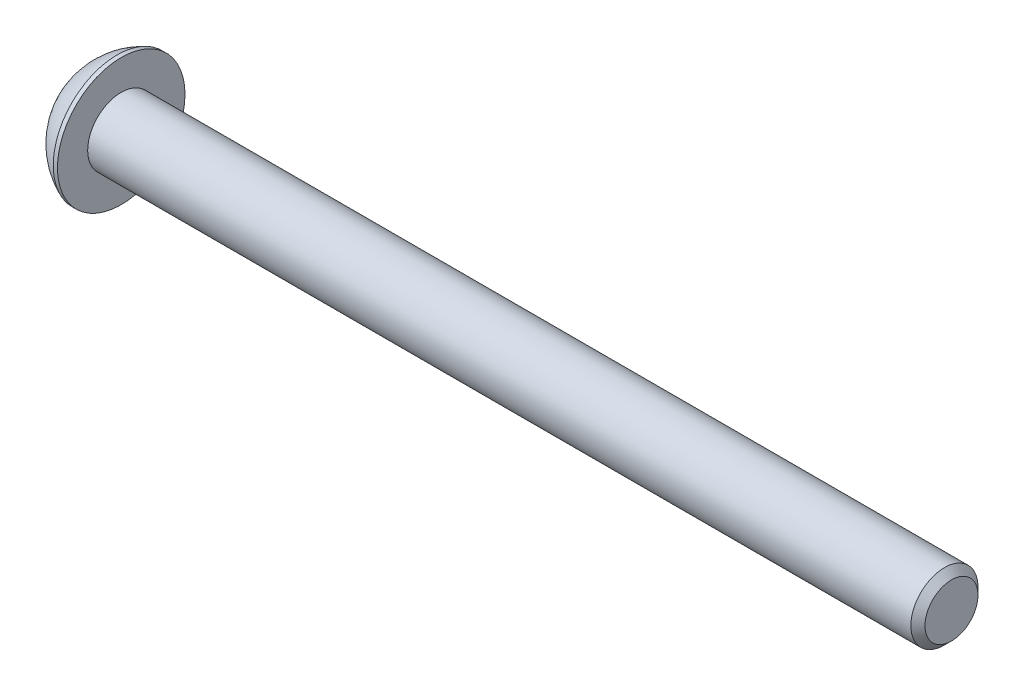
ISO-10303-21;
HEADER;
FILE_DESCRIPTION(('STEP AP214'),'2;1');
FILE_NAME('part.step','',(''),(''),'','','');
FILE_SCHEMA(('AUTOMOTIVE_DESIGN { 1 0 10303 214 1 1 1 1 }'));
ENDSEC;
DATA;
#1=APPLICATION_CONTEXT('core data for automotive mechanical design processes');
#2=APPLICATION_PROTOCOL_DEFINITION('international standard','automotive_design',2000,#1);
#3=PRODUCT_CONTEXT('',#1,'mechanical');
#4=PRODUCT('Part','Part','',(#3));
#5=PRODUCT_RELATED_PRODUCT_CATEGORY('part','',(#4));
#6=PRODUCT_DEFINITION_FORMATION('','',#4);
#7=PRODUCT_DEFINITION_CONTEXT('part definition',#1,'design');
#8=PRODUCT_DEFINITION('design','',#6,#7);
#9=PRODUCT_DEFINITION_SHAPE('','',#8);
#10=(LENGTH_UNIT() NAMED_UNIT(*) SI_UNIT(.MILLI.,.METRE.));
#11=(NAMED_UNIT(*) PLANE_ANGLE_UNIT() SI_UNIT($,.RADIAN.));
#12=(NAMED_UNIT(*) SI_UNIT($,.STERADIAN.) SOLID_ANGLE_UNIT());
#13=UNCERTAINTY_MEASURE_WITH_UNIT(LENGTH_MEASURE(1.E-05),#10,'distance_accuracy_value','');
#14=(GEOMETRIC_REPRESENTATION_CONTEXT(3) GLOBAL_UNCERTAINTY_ASSIGNED_CONTEXT((#13)) GLOBAL_UNIT_ASSIGNED_CONTEXT((#10,
#11,#12)) REPRESENTATION_CONTEXT('',''));
#15=CARTESIAN_POINT('',(0.,0.,0.));
#16=DIRECTION('',(0.,0.,1.));
#17=DIRECTION('',(1.,0.,0.));
#18=AXIS2_PLACEMENT_3D('',#15,#16,#17);
#19=CARTESIAN_POINT('',(-0.279400000000001,-1.5875,0.916543552338531));
#20=DIRECTION('',(-1.,0.,0.));
#21=DIRECTION('',(0.,0.,1.));
#22=AXIS2_PLACEMENT_3D('',#19,#20,#21);
#23=PLANE('',#22);
#24=DIRECTION('',(0.,0.866025403784439,0.5));
#25=VECTOR('',#24,1.);
#26=CARTESIAN_POINT('',(-0.279400000000001,1.5875,-0.916543552338531));
#27=LINE('',#26,#25);
#28=CARTESIAN_POINT('',(-0.279400000000001,1.5875,-0.916543552338531));
#29=VERTEX_POINT('',#28);
#30=CARTESIAN_POINT('',(-0.279400000000001,0.,-1.83308710467706));
#31=VERTEX_POINT('',#30);
#32=EDGE_CURVE('E72',#29,#31,#27,.F.);
#33=ORIENTED_EDGE('',*,*,#32,.T.);
#34=DIRECTION('',(0.,0.866025403784439,-0.499999999999999));
#35=VECTOR('',#34,1.);
#36=CARTESIAN_POINT('',(-0.279400000000001,0.,-1.83308710467706));
#37=LINE('',#36,#35);
#38=CARTESIAN_POINT('',(-0.279400000000001,-1.5875,-0.916543552338532));
#39=VERTEX_POINT('',#38);
#40=EDGE_CURVE('E74',#31,#39,#37,.F.);
#41=ORIENTED_EDGE('',*,*,#40,.T.);
#42=DIRECTION('',(0.,0.,-1.));
#43=VECTOR('',#42,1.);
#44=CARTESIAN_POINT('',(-0.279400000000001,-1.5875,-0.916543552338532));
#45=LINE('',#44,#43);
#46=CARTESIAN_POINT('',(-0.279400000000001,-1.5875,0.916543552338531));
#47=VERTEX_POINT('',#46);
#48=EDGE_CURVE('E76',#39,#47,#45,.F.);
#49=ORIENTED_EDGE('',*,*,#48,.T.);
#50=DIRECTION('',(0.,-0.866025403784439,-0.5));
#51=VECTOR('',#50,1.);
#52=CARTESIAN_POINT('',(-0.279400000000001,-1.5875,0.916543552338531));
#53=LINE('',#52,#51);
#54=CARTESIAN_POINT('',(-0.279400000000001,0.,1.83308710467706));
#55=VERTEX_POINT('',#54);
#56=EDGE_CURVE('E132',#47,#55,#53,.F.);
#57=ORIENTED_EDGE('',*,*,#56,.T.);
#58=DIRECTION('',(0.,-0.866025403784439,0.5));
#59=VECTOR('',#58,1.);
#60=CARTESIAN_POINT('',(-0.279400000000001,0.,1.83308710467706));
#61=LINE('',#60,#59);
#62=CARTESIAN_POINT('',(-0.279400000000001,1.5875,0.916543552338531));
#63=VERTEX_POINT('',#62);
#64=EDGE_CURVE('E137',#55,#63,#61,.F.);
#65=ORIENTED_EDGE('',*,*,#64,.T.);
#66=DIRECTION('',(0.,0.,1.));
#67=VECTOR('',#66,1.);
#68=CARTESIAN_POINT('',(-0.279400000000001,1.5875,0.916543552338531));
#69=LINE('',#68,#67);
#70=EDGE_CURVE('E141',#63,#29,#69,.F.);
#71=ORIENTED_EDGE('',*,*,#70,.T.);
#72=EDGE_LOOP('',(#33,#41,#49,#57,#65,#71));
#73=FACE_BOUND('',#72,.T.);
#74=ADVANCED_FACE('F17',(#73),#23,.T.);
#75=CARTESIAN_POINT('',(-0.279400000000001,-1.5875,-0.916543552338532));
#76=DIRECTION('',(0.,-1.,0.));
#77=DIRECTION('',(0.,0.,-1.));
#78=AXIS2_PLACEMENT_3D('',#75,#76,#77);
#79=PLANE('',#78);
#80=DIRECTION('',(1.,0.,0.));
#81=VECTOR('',#80,1.);
#82=CARTESIAN_POINT('',(-0.279400000000001,-1.5875,0.916543552338531));
#83=LINE('',#82,#81);
#84=CARTESIAN_POINT('',(-2.5654,-1.5875,0.91654355233853));
#85=VERTEX_POINT('',#84);
#86=EDGE_CURVE('E87',#85,#47,#83,.T.);
#87=ORIENTED_EDGE('',*,*,#86,.T.);
#88=ORIENTED_EDGE('',*,*,#48,.F.);
#89=DIRECTION('',(1.,0.,0.));
#90=VECTOR('',#89,1.);
#91=CARTESIAN_POINT('',(-0.279400000000001,-1.5875,-0.916543552338532));
#92=LINE('',#91,#90);
#93=CARTESIAN_POINT('',(-2.5654,-1.5875,-0.916543552338532));
#94=VERTEX_POINT('',#93);
#95=EDGE_CURVE('E81',#39,#94,#92,.F.);
#96=ORIENTED_EDGE('',*,*,#95,.T.);
#97=DIRECTION('',(0.,0.,1.));
#98=VECTOR('',#97,1.);
#99=CARTESIAN_POINT('',(-2.5654,-1.5875,0.));
#100=LINE('',#99,#98);
#101=EDGE_CURVE('E129',#85,#94,#100,.F.);
#102=ORIENTED_EDGE('',*,*,#101,.F.);
#103=EDGE_LOOP('',(#87,#88,#96,#102));
#104=FACE_BOUND('',#103,.T.);
#105=ADVANCED_FACE('F84',(#104),#79,.F.);
#106=CARTESIAN_POINT('',(-0.279400000000001,0.,-1.83308710467706));
#107=DIRECTION('',(0.,-0.499999999999999,-0.866025403784439));
#108=DIRECTION('',(0.,0.866025403784439,-0.499999999999999));
#109=AXIS2_PLACEMENT_3D('',#106,#107,#108);
#110=PLANE('',#109);
#111=ORIENTED_EDGE('',*,*,#95,.F.);
#112=ORIENTED_EDGE('',*,*,#40,.F.);
#113=DIRECTION('',(1.,0.,0.));
#114=VECTOR('',#113,1.);
#115=CARTESIAN_POINT('',(-0.279400000000001,0.,-1.83308710467706));
#116=LINE('',#115,#114);
#117=CARTESIAN_POINT('',(-2.5654,0.,-1.83308710467706));
#118=VERTEX_POINT('',#117);
#119=EDGE_CURVE('E95',#31,#118,#116,.F.);
#120=ORIENTED_EDGE('',*,*,#119,.T.);
#121=DIRECTION('',(0.,0.866025403784439,-0.499999999999999));
#122=VECTOR('',#121,1.);
#123=CARTESIAN_POINT('',(-2.5654,-1.5875,-0.916543552338532));
#124=LINE('',#123,#122);
#125=EDGE_CURVE('E92',#94,#118,#124,.T.);
#126=ORIENTED_EDGE('',*,*,#125,.F.);
#127=EDGE_LOOP('',(#111,#112,#120,#126));
#128=FACE_BOUND('',#127,.T.);
#129=ADVANCED_FACE('F90',(#128),#110,.F.);
#130=CARTESIAN_POINT('',(-0.279400000000001,1.5875,-0.916543552338531));
#131=DIRECTION('',(0.,0.5,-0.866025403784439));
#132=DIRECTION('',(0.,0.866025403784439,0.5));
#133=AXIS2_PLACEMENT_3D('',#130,#131,#132);
#134=PLANE('',#133);
#135=ORIENTED_EDGE('',*,*,#119,.F.);
#136=ORIENTED_EDGE('',*,*,#32,.F.);
#137=DIRECTION('',(1.,0.,0.));
#138=VECTOR('',#137,1.);
#139=CARTESIAN_POINT('',(-0.279400000000001,1.5875,-0.91654355233853));
#140=LINE('',#139,#138);
#141=CARTESIAN_POINT('',(-2.5654,1.5875,-0.91654355233853));
#142=VERTEX_POINT('',#141);
#143=EDGE_CURVE('E139',#29,#142,#140,.F.);
#144=ORIENTED_EDGE('',*,*,#143,.T.);
#145=DIRECTION('',(0.,0.866025403784438,0.5));
#146=VECTOR('',#145,1.);
#147=CARTESIAN_POINT('',(-2.5654,0.,-1.83308710467706));
#148=LINE('',#147,#146);
#149=EDGE_CURVE('E125',#118,#142,#148,.T.);
#150=ORIENTED_EDGE('',*,*,#149,.F.);
#151=EDGE_LOOP('',(#135,#136,#144,#150));
#152=FACE_BOUND('',#151,.T.);
#153=ADVANCED_FACE('F144',(#152),#134,.F.);
#154=CARTESIAN_POINT('',(-0.279400000000001,1.5875,0.916543552338531));
#155=DIRECTION('',(0.,1.,0.));
#156=DIRECTION('',(0.,0.,1.));
#157=AXIS2_PLACEMENT_3D('',#154,#155,#156);
#158=PLANE('',#157);
#159=ORIENTED_EDGE('',*,*,#143,.F.);
#160=ORIENTED_EDGE('',*,*,#70,.F.);
#161=DIRECTION('',(1.,0.,0.));
#162=VECTOR('',#161,1.);
#163=CARTESIAN_POINT('',(-0.279400000000001,1.5875,0.916543552338531));
#164=LINE('',#163,#162);
#165=CARTESIAN_POINT('',(-2.5654,1.5875,0.916543552338531));
#166=VERTEX_POINT('',#165);
#167=EDGE_CURVE('E135',#63,#166,#164,.F.);
#168=ORIENTED_EDGE('',*,*,#167,.T.);
#169=DIRECTION('',(0.,0.,1.));
#170=VECTOR('',#169,1.);
#171=CARTESIAN_POINT('',(-2.5654,1.5875,0.));
#172=LINE('',#171,#170);
#173=EDGE_CURVE('E117',#142,#166,#172,.T.);
#174=ORIENTED_EDGE('',*,*,#173,.F.);
#175=EDGE_LOOP('',(#159,#160,#168,#174));
#176=FACE_BOUND('',#175,.T.);
#177=ADVANCED_FACE('F154',(#176),#158,.F.);
#178=CARTESIAN_POINT('',(-0.279400000000001,0.,1.83308710467706));
#179=DIRECTION('',(0.,0.5,0.866025403784439));
#180=DIRECTION('',(0.,-0.866025403784439,0.5));
#181=AXIS2_PLACEMENT_3D('',#178,#179,#180);
#182=PLANE('',#181);
#183=ORIENTED_EDGE('',*,*,#167,.F.);
#184=ORIENTED_EDGE('',*,*,#64,.F.);
#185=DIRECTION('',(1.,0.,0.));
#186=VECTOR('',#185,1.);
#187=CARTESIAN_POINT('',(-0.279400000000001,0.,1.83308710467706));
#188=LINE('',#187,#186);
#189=CARTESIAN_POINT('',(-2.5654,0.,1.83308710467706));
#190=VERTEX_POINT('',#189);
#191=EDGE_CURVE('E39',#55,#190,#188,.F.);
#192=ORIENTED_EDGE('',*,*,#191,.T.);
#193=DIRECTION('',(0.,-0.866025403784439,0.5));
#194=VECTOR('',#193,1.);
#195=CARTESIAN_POINT('',(-2.5654,1.5875,0.916543552338531));
#196=LINE('',#195,#194);
#197=EDGE_CURVE('E113',#166,#190,#196,.T.);
#198=ORIENTED_EDGE('',*,*,#197,.F.);
#199=EDGE_LOOP('',(#183,#184,#192,#198));
#200=FACE_BOUND('',#199,.T.);
#201=ADVANCED_FACE('F152',(#200),#182,.F.);
#202=CARTESIAN_POINT('',(-0.279400000000001,-1.5875,0.916543552338531));
#203=DIRECTION('',(0.,-0.5,0.866025403784439));
#204=DIRECTION('',(0.,-0.866025403784439,-0.5));
#205=AXIS2_PLACEMENT_3D('',#202,#203,#204);
#206=PLANE('',#205);
#207=ORIENTED_EDGE('',*,*,#191,.F.);
#208=ORIENTED_EDGE('',*,*,#56,.F.);
#209=ORIENTED_EDGE('',*,*,#86,.F.);
#210=DIRECTION('',(0.,-0.866025403784439,-0.5));
#211=VECTOR('',#210,1.);
#212=CARTESIAN_POINT('',(-2.5654,0.,1.83308710467706));
#213=LINE('',#212,#211);
#214=EDGE_CURVE('E109',#190,#85,#213,.T.);
#215=ORIENTED_EDGE('',*,*,#214,.F.);
#216=EDGE_LOOP('',(#207,#208,#209,#215));
#217=FACE_BOUND('',#216,.T.);
#218=ADVANCED_FACE('F149',(#217),#206,.F.);
#219=CARTESIAN_POINT('',(-2.5654,0.,0.));
#220=DIRECTION('',(-1.,0.,0.));
#221=DIRECTION('',(0.,0.,1.));
#222=AXIS2_PLACEMENT_3D('',#219,#220,#221);
#223=PLANE('',#222);
#224=CARTESIAN_POINT('',(-2.5654,-2.71185892700929,0.));
#225=CARTESIAN_POINT('',(-2.56540000000001,-2.71185847072418,-0.0761404942765253));
#226=CARTESIAN_POINT('',(-2.56540000000002,-2.70864938060212,-0.152294981425624));
#227=CARTESIAN_POINT('',(-2.56539999999998,-2.69583388372318,-0.304077681628868));
#228=CARTESIAN_POINT('',(-2.56539999999991,-2.68622558827802,-0.379705732647686));
#229=CARTESIAN_POINT('',(-2.56540000000009,-2.66065490881383,-0.530010879140968));
#230=CARTESIAN_POINT('',(-2.56540000000034,-2.64468243840386,-0.604686269953536));
#231=CARTESIAN_POINT('',(-2.56539999999966,-2.60649350996904,-0.752467566515338));
#232=CARTESIAN_POINT('',(-2.56539999999873,-2.58427198490783,-0.825572146580135));
#233=CARTESIAN_POINT('',(-2.56539999999772,-2.5085410524322,-1.04143356589695));
#234=CARTESIAN_POINT('',(-2.5653999999994,-2.4459030835386,-1.18110136080603));
#235=CARTESIAN_POINT('',(-2.5654000000006,-2.29803476587233,-1.44792299073314));
#236=CARTESIAN_POINT('',(-2.56540000000011,-2.21280355826736,-1.57507634979041));
#237=CARTESIAN_POINT('',(-2.56539999999995,-2.06995220291191,-1.75365796413872));
#238=CARTESIAN_POINT('',(-2.56539999999999,-2.01979661176297,-1.81119407207896));
#239=CARTESIAN_POINT('',(-2.56540000000002,-1.91485632684536,-1.92179690442521));
#240=CARTESIAN_POINT('',(-2.5654,-1.86007614285279,-1.97486788450532));
#241=CARTESIAN_POINT('',(-2.5654,-1.74621346315664,-2.07622957647259));
#242=CARTESIAN_POINT('',(-2.5654,-1.6871290297829,-2.12451811204811));
#243=CARTESIAN_POINT('',(-2.5654,-1.56510764679094,-2.21595098283864));
#244=CARTESIAN_POINT('',(-2.5654,-1.50216980805588,-2.25909412400828));
#245=CARTESIAN_POINT('',(-2.5654,-1.30826245369127,-2.3802951447152));
#246=CARTESIAN_POINT('',(-2.5654,-1.17207876898838,-2.45023154336907));
#247=CARTESIAN_POINT('',(-2.5654,-0.889976414478254,-2.56620581591486));
#248=CARTESIAN_POINT('',(-2.5654,-0.744057848662872,-2.61224394505147));
#249=CARTESIAN_POINT('',(-2.5654,-0.446543860067375,-2.67918147075385));
#250=CARTESIAN_POINT('',(-2.5654,-0.29494840697473,-2.70008073306741));
#251=CARTESIAN_POINT('',(-2.5654,0.0095993118700588,-2.71612561953058));
#252=CARTESIAN_POINT('',(-2.5654,0.162551577622202,-2.7112712436802));
#253=CARTESIAN_POINT('',(-2.5654,0.465452148356845,-2.67596614481665));
#254=CARTESIAN_POINT('',(-2.5654,0.615400469377249,-2.64551555849764));
#255=CARTESIAN_POINT('',(-2.5654,0.908127355925688,-2.55982576794858));
#256=CARTESIAN_POINT('',(-2.5654,1.05090584485788,-2.50458629895969));
#257=CARTESIAN_POINT('',(-2.5654,1.25647518144684,-2.40443143212101));
#258=CARTESIAN_POINT('',(-2.5654,1.32359795245922,-2.36814044444851));
#259=CARTESIAN_POINT('',(-2.5654,1.45455132491647,-2.29003537412425));
#260=CARTESIAN_POINT('',(-2.5654,1.51838268508943,-2.24822257233345));
#261=CARTESIAN_POINT('',(-2.5654,1.64226581046967,-2.15938635408837));
#262=CARTESIAN_POINT('',(-2.5654,1.70231927394012,-2.11236530550237));
#263=CARTESIAN_POINT('',(-2.5654,1.81830042907491,-2.01340156681398));
#264=CARTESIAN_POINT('',(-2.5654,1.87422408310218,-1.96145417072293));
#265=CARTESIAN_POINT('',(-2.5654,2.03504944058047,-1.79887155448733));
#266=CARTESIAN_POINT('',(-2.5654,2.13316970514206,-1.68137794124951));
#267=CARTESIAN_POINT('',(-2.5654,2.30825624449802,-1.43157096516116));
#268=CARTESIAN_POINT('',(-2.5654,2.38522332335772,-1.29925816588002));
#269=CARTESIAN_POINT('',(-2.5654,2.48321707915614,-1.09254931191464));
#270=CARTESIAN_POINT('',(-2.5654,2.51299719529699,-1.02218440244162));
#271=CARTESIAN_POINT('',(-2.5654,2.56650312345239,-0.87923398614022));
#272=CARTESIAN_POINT('',(-2.5654,2.59023383515378,-0.806650330086216));
#273=CARTESIAN_POINT('',(-2.5654,2.63145656628543,-0.659864148350011));
#274=CARTESIAN_POINT('',(-2.5654,2.6489584371486,-0.585664377740199));
#275=CARTESIAN_POINT('',(-2.5654,2.67765185406404,-0.436068546023715));
#276=CARTESIAN_POINT('',(-2.5654,2.68884526132281,-0.360672844512987));
#277=CARTESIAN_POINT('',(-2.5654,2.70184657014729,-0.237633571603051));
#278=CARTESIAN_POINT('',(-2.5654,2.70560001579497,-0.190186994782926));
#279=CARTESIAN_POINT('',(-2.5654,2.710606336803,-0.095162100322192));
#280=CARTESIAN_POINT('',(-2.5654,2.71185921216336,-0.0475837826815835));
#281=CARTESIAN_POINT('',(-2.56540000000001,2.71185847072418,0.0761404942765254));
#282=CARTESIAN_POINT('',(-2.56540000000002,2.70864938060212,0.152294981425625));
#283=CARTESIAN_POINT('',(-2.56539999999998,2.69583388372318,0.304077681628867));
#284=CARTESIAN_POINT('',(-2.56539999999991,2.68622558827802,0.379705732647686));
#285=CARTESIAN_POINT('',(-2.56540000000009,2.66065490881383,0.530010879140967));
#286=CARTESIAN_POINT('',(-2.56540000000034,2.64468243840386,0.604686269953536));
#287=CARTESIAN_POINT('',(-2.56539999999966,2.60649350996904,0.752467566515338));
#288=CARTESIAN_POINT('',(-2.56539999999873,2.58427198490783,0.825572146580134));
#289=CARTESIAN_POINT('',(-2.56539999999772,2.5085410524322,1.04143356589695));
#290=CARTESIAN_POINT('',(-2.5653999999994,2.44590308353861,1.18110136080603));
#291=CARTESIAN_POINT('',(-2.5654000000006,2.29803476587233,1.44792299073314));
#292=CARTESIAN_POINT('',(-2.56540000000011,2.21280355826736,1.57507634979041));
#293=CARTESIAN_POINT('',(-2.56539999999995,2.06995220291191,1.75365796413872));
#294=CARTESIAN_POINT('',(-2.56539999999999,2.01979661176297,1.81119407207896));
#295=CARTESIAN_POINT('',(-2.56540000000002,1.91485632684536,1.92179690442521));
#296=CARTESIAN_POINT('',(-2.5654,1.86007614285279,1.97486788450532));
#297=CARTESIAN_POINT('',(-2.5654,1.74621346315664,2.07622957647259));
#298=CARTESIAN_POINT('',(-2.5654,1.68712902978291,2.12451811204811));
#299=CARTESIAN_POINT('',(-2.5654,1.56510764679094,2.21595098283864));
#300=CARTESIAN_POINT('',(-2.5654,1.50216980805588,2.25909412400828));
#301=CARTESIAN_POINT('',(-2.5654,1.30826245369127,2.3802951447152));
#302=CARTESIAN_POINT('',(-2.5654,1.17207876898839,2.45023154336907));
#303=CARTESIAN_POINT('',(-2.5654,0.889976414478256,2.56620581591486));
#304=CARTESIAN_POINT('',(-2.5654,0.744057848662876,2.61224394505147));
#305=CARTESIAN_POINT('',(-2.5654,0.446543860067379,2.67918147075385));
#306=CARTESIAN_POINT('',(-2.5654,0.294948406974733,2.70008073306741));
#307=CARTESIAN_POINT('',(-2.5654,-0.00959931187005636,2.71612561953058));
#308=CARTESIAN_POINT('',(-2.5654,-0.1625515776222,2.7112712436802));
#309=CARTESIAN_POINT('',(-2.5654,-0.465452148356843,2.67596614481665));
#310=CARTESIAN_POINT('',(-2.5654,-0.615400469377247,2.64551555849764));
#311=CARTESIAN_POINT('',(-2.5654,-0.908127355925686,2.55982576794858));
#312=CARTESIAN_POINT('',(-2.5654,-1.05090584485788,2.50458629895969));
#313=CARTESIAN_POINT('',(-2.5654,-1.25647518144684,2.40443143212101));
#314=CARTESIAN_POINT('',(-2.5654,-1.32359795245922,2.36814044444851));
#315=CARTESIAN_POINT('',(-2.5654,-1.45455132491647,2.29003537412425));
#316=CARTESIAN_POINT('',(-2.5654,-1.51838268508943,2.24822257233345));
#317=CARTESIAN_POINT('',(-2.5654,-1.64226581046967,2.15938635408837));
#318=CARTESIAN_POINT('',(-2.5654,-1.70231927394012,2.11236530550237));
#319=CARTESIAN_POINT('',(-2.5654,-1.81830042907491,2.01340156681398));
#320=CARTESIAN_POINT('',(-2.5654,-1.87422408310218,1.96145417072293));
#321=CARTESIAN_POINT('',(-2.5654,-2.03504944058047,1.79887155448734));
#322=CARTESIAN_POINT('',(-2.5654,-2.13316970514206,1.68137794124951));
#323=CARTESIAN_POINT('',(-2.5654,-2.30825624449801,1.43157096516116));
#324=CARTESIAN_POINT('',(-2.5654,-2.38522332335772,1.29925816588002));
#325=CARTESIAN_POINT('',(-2.5654,-2.48321707915613,1.09254931191464));
#326=CARTESIAN_POINT('',(-2.5654,-2.51299719529699,1.02218440244162));
#327=CARTESIAN_POINT('',(-2.5654,-2.56650312345239,0.879233986140222));
#328=CARTESIAN_POINT('',(-2.5654,-2.59023383515378,0.806650330086218));
#329=CARTESIAN_POINT('',(-2.5654,-2.63145656628543,0.659864148350014));
#330=CARTESIAN_POINT('',(-2.5654,-2.6489584371486,0.585664377740202));
#331=CARTESIAN_POINT('',(-2.5654,-2.67765185406404,0.436068546023719));
#332=CARTESIAN_POINT('',(-2.5654,-2.68884526132281,0.360672844512992));
#333=CARTESIAN_POINT('',(-2.5654,-2.7018465701473,0.237633571603056));
#334=CARTESIAN_POINT('',(-2.5654,-2.70560001579497,0.190186994782929));
#335=CARTESIAN_POINT('',(-2.5654,-2.710606336803,0.0951621003221936));
#336=CARTESIAN_POINT('',(-2.5654,-2.71185921216336,0.0475837826815844));
#337=CARTESIAN_POINT('',(-2.5654,-2.71185892700929,0.));
#338=B_SPLINE_CURVE_WITH_KNOTS('',3,(#224,#225,#226,#227,#228,#229,#230,#231,#232,#233,#234,
#235,#236,#237,#238,#239,#240,#241,#242,#243,#244,#245,#246,#247,#248,#249,#250,#251,#252,#253,
#254,#255,#256,#257,#258,#259,#260,#261,#262,#263,#264,#265,#266,#267,#268,#269,#270,#271,#272,
#273,#274,#275,#276,#277,#278,#279,#280,#281,#282,#283,#284,#285,#286,#287,#288,#289,#290,#291,
#292,#293,#294,#295,#296,#297,#298,#299,#300,#301,#302,#303,#304,#305,#306,#307,#308,#309,#310,
#311,#312,#313,#314,#315,#316,#317,#318,#319,#320,#321,#322,#323,#324,#325,#326,#327,#328,#329,
#330,#331,#332,#333,#334,#335,#336,#337),.UNSPECIFIED.,.T.,.F.,(4,2,2,2,2,2,2,2,2,2,2,2,2,2,2,2,
2,2,2,2,2,2,2,2,2,2,2,2,2,2,2,2,2,2,2,2,2,2,2,2,2,2,2,2,2,2,2,2,2,2,2,2,2,2,2,2,4),(0.,
0.228377677447661,0.456822789128397,0.685631406016179,0.91462608963498,1.37152386627063,
1.82843901336182,2.0571959516759,2.28573233384701,2.51437224108269,2.7430651039076,
3.19997400582149,3.65687802763445,4.11378448949794,4.57069095136139,5.02759497317428,
5.48450387508824,5.7131967379132,5.94183664514897,6.17037302732006,6.39912996563402,
6.85604511272442,7.31294288935978,7.54193757297888,7.7707461898668,7.99919130154747,
8.22756897899513,8.37029295099255,8.51301692298999,8.74139460043765,8.96983971211839,
9.19864832900617,9.42764301262497,9.88454078926062,10.3414559363518,10.5702128746659,
10.798749256837,11.0273891640727,11.2560820268976,11.7129909288115,12.1698949506244,
12.6268014124879,13.0837078743514,13.5406118961643,13.9975207980782,14.2262136609032,
14.454853568139,14.68338995031,14.912146888624,15.3690620357144,15.8259598123498,
16.0549544959689,16.2837631128568,16.5122082245375,16.7405859019851,16.8833098739825,
17.02603384598),.UNSPECIFIED.);
#339=CARTESIAN_POINT('',(-2.5654,-2.71185892700929,0.));
#340=VERTEX_POINT('',#339);
#341=EDGE_CURVE('E20',#340,#340,#338,.T.);
#342=ORIENTED_EDGE('',*,*,#341,.F.);
#343=EDGE_LOOP('',(#342));
#344=FACE_BOUND('',#343,.T.);
#345=ORIENTED_EDGE('',*,*,#197,.T.);
#346=ORIENTED_EDGE('',*,*,#214,.T.);
#347=ORIENTED_EDGE('',*,*,#101,.T.);
#348=ORIENTED_EDGE('',*,*,#125,.T.);
#349=ORIENTED_EDGE('',*,*,#149,.T.);
#350=ORIENTED_EDGE('',*,*,#173,.T.);
#351=EDGE_LOOP('',(#345,#346,#347,#348,#349,#350));
#352=FACE_BOUND('',#351,.T.);
#353=ADVANCED_FACE('F147',(#344,#352),#223,.T.);
#354=CARTESIAN_POINT('',(1.5875,0.,0.));
#355=DIRECTION('',(0.,1.,0.));
#356=DIRECTION('',(-1.,0.,0.));
#357=AXIS2_PLACEMENT_3D('',#354,#355,#356);
#358=SPHERICAL_SURFACE('',#357,4.95991504463534);
#359=ORIENTED_EDGE('',*,*,#341,.T.);
#360=EDGE_LOOP('',(#359));
#361=FACE_BOUND('',#360,.T.);
#362=CARTESIAN_POINT('',(-0.304927848030147,0.,0.));
#363=DIRECTION('',(1.,0.,0.));
#364=DIRECTION('',(0.,0.,-1.));
#365=AXIS2_PLACEMENT_3D('',#362,#363,#364);
#366=CIRCLE('',#365,4.5847);
#367=CARTESIAN_POINT('',(-0.304927848030147,0.,-4.5847));
#368=VERTEX_POINT('',#367);
#369=EDGE_CURVE('E104',#368,#368,#366,.T.);
#370=ORIENTED_EDGE('',*,*,#369,.F.);
#371=EDGE_LOOP('',(#370));
#372=FACE_BOUND('',#371,.T.);
#373=ADVANCED_FACE('F185',(#361,#372),#358,.T.);
#374=CARTESIAN_POINT('',(59.69,0.,0.));
#375=DIRECTION('',(1.,0.,0.));
#376=DIRECTION('',(0.,0.,-1.));
#377=AXIS2_PLACEMENT_3D('',#374,#375,#376);
#378=PLANE('',#377);
#379=CARTESIAN_POINT('',(59.6899999999323,0.,0.));
#380=DIRECTION('',(-1.,0.,0.));
#381=DIRECTION('',(0.,0.,1.));
#382=AXIS2_PLACEMENT_3D('',#379,#380,#381);
#383=CIRCLE('',#382,1.90499999996518);
#384=CARTESIAN_POINT('',(59.6899999999323,0.,1.90499999996518));
#385=VERTEX_POINT('',#384);
#386=EDGE_CURVE('E102',#385,#385,#383,.T.);
#387=ORIENTED_EDGE('',*,*,#386,.F.);
#388=EDGE_LOOP('',(#387));
#389=FACE_BOUND('',#388,.T.);
#390=ADVANCED_FACE('F183',(#389),#378,.T.);
#391=CARTESIAN_POINT('',(0.,0.,0.));
#392=DIRECTION('',(1.,0.,0.));
#393=DIRECTION('',(0.,0.,-1.));
#394=AXIS2_PLACEMENT_3D('',#391,#392,#393);
#395=CYLINDRICAL_SURFACE('',#394,4.5847);
#396=ORIENTED_EDGE('',*,*,#369,.T.);
#397=EDGE_LOOP('',(#396));
#398=FACE_BOUND('',#397,.T.);
#399=CARTESIAN_POINT('',(0.,0.,0.));
#400=DIRECTION('',(1.,0.,0.));
#401=DIRECTION('',(0.,0.,-1.));
#402=AXIS2_PLACEMENT_3D('',#399,#400,#401);
#403=CIRCLE('',#402,4.5847);
#404=CARTESIAN_POINT('',(0.,0.,-4.5847));
#405=VERTEX_POINT('',#404);
#406=EDGE_CURVE('E99',#405,#405,#403,.T.);
#407=ORIENTED_EDGE('',*,*,#406,.F.);
#408=EDGE_LOOP('',(#407));
#409=FACE_BOUND('',#408,.T.);
#410=ADVANCED_FACE('F179',(#398,#409),#395,.T.);
#411=CARTESIAN_POINT('',(59.1819999999643,0.,0.));
#412=DIRECTION('',(-1.,0.,0.));
#413=DIRECTION('',(0.,0.,1.));
#414=AXIS2_PLACEMENT_3D('',#411,#412,#413);
#415=CONICAL_SURFACE('',#414,2.41299999993316,0.785398163397448);
#416=CARTESIAN_POINT('',(59.182,0.,0.));
#417=DIRECTION('',(-1.,0.,0.));
#418=DIRECTION('',(0.,0.,1.));
#419=AXIS2_PLACEMENT_3D('',#416,#417,#418);
#420=CIRCLE('',#419,2.413);
#421=CARTESIAN_POINT('',(59.182,0.,2.413));
#422=VERTEX_POINT('',#421);
#423=EDGE_CURVE('E30',#422,#422,#420,.T.);
#424=ORIENTED_EDGE('',*,*,#423,.F.);
#425=EDGE_LOOP('',(#424));
#426=FACE_BOUND('',#425,.T.);
#427=ORIENTED_EDGE('',*,*,#386,.T.);
#428=EDGE_LOOP('',(#427));
#429=FACE_BOUND('',#428,.T.);
#430=ADVANCED_FACE('F172',(#426,#429),#415,.T.);
#431=CARTESIAN_POINT('',(0.,4.5847,0.));
#432=DIRECTION('',(1.,0.,0.));
#433=DIRECTION('',(0.,0.,-1.));
#434=AXIS2_PLACEMENT_3D('',#431,#432,#433);
#435=PLANE('',#434);
#436=CARTESIAN_POINT('',(0.,0.,0.));
#437=DIRECTION('',(-1.,0.,0.));
#438=DIRECTION('',(0.,0.,1.));
#439=AXIS2_PLACEMENT_3D('',#436,#437,#438);
#440=CIRCLE('',#439,2.413);
#441=CARTESIAN_POINT('',(0.,0.,2.413));
#442=VERTEX_POINT('',#441);
#443=EDGE_CURVE('E11',#442,#442,#440,.F.);
#444=ORIENTED_EDGE('',*,*,#443,.F.);
#445=EDGE_LOOP('',(#444));
#446=FACE_BOUND('',#445,.T.);
#447=ORIENTED_EDGE('',*,*,#406,.T.);
#448=EDGE_LOOP('',(#447));
#449=FACE_BOUND('',#448,.T.);
#450=ADVANCED_FACE('F166',(#446,#449),#435,.T.);
#451=CARTESIAN_POINT('',(59.69,0.,0.));
#452=DIRECTION('',(-1.,0.,0.));
#453=DIRECTION('',(0.,0.,1.));
#454=AXIS2_PLACEMENT_3D('',#451,#452,#453);
#455=CYLINDRICAL_SURFACE('',#454,2.413);
#456=ORIENTED_EDGE('',*,*,#443,.T.);
#457=EDGE_LOOP('',(#456));
#458=FACE_BOUND('',#457,.T.);
#459=ORIENTED_EDGE('',*,*,#423,.T.);
#460=EDGE_LOOP('',(#459));
#461=FACE_BOUND('',#460,.T.);
#462=ADVANCED_FACE('F164',(#458,#461),#455,.T.);
#463=CLOSED_SHELL('',(#74,#105,#129,#153,#177,#201,#218,#353,#373,#390,#410,#430,#450,#462));
#464=MANIFOLD_SOLID_BREP('B1',#463);
#465=ADVANCED_BREP_SHAPE_REPRESENTATION('',(#18,#464),#14);
#466=SHAPE_DEFINITION_REPRESENTATION(#9,#465);
ENDSEC;
END-ISO-10303-21;
